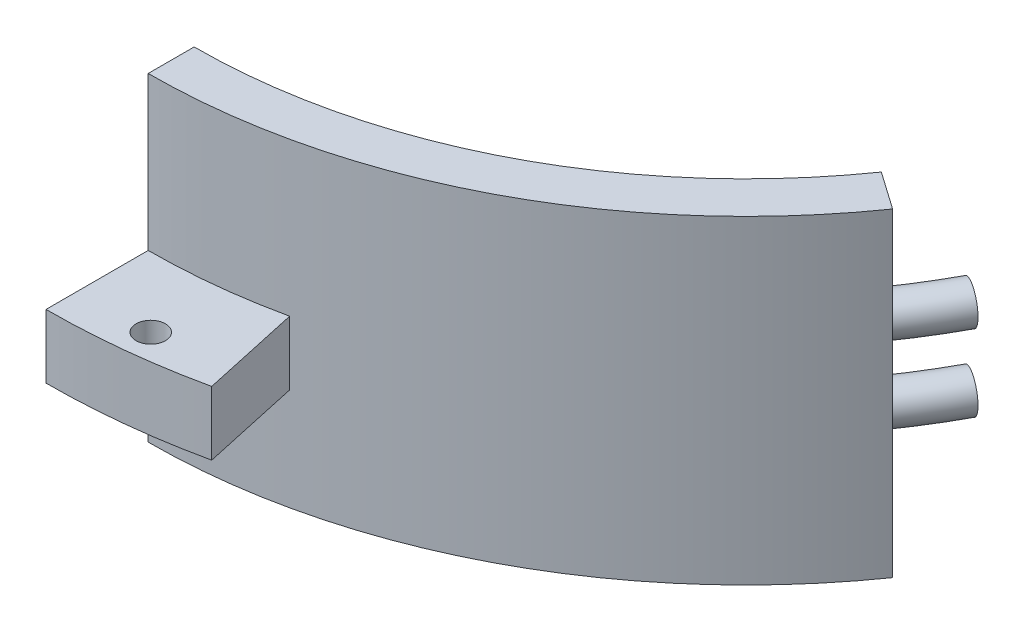
ISO-10303-21;
HEADER;
FILE_DESCRIPTION(('STEP AP214'),'2;1');
FILE_NAME('part.step','',(''),(''),'','','');
FILE_SCHEMA(('AUTOMOTIVE_DESIGN { 1 0 10303 214 1 1 1 1 }'));
ENDSEC;
DATA;
#1=APPLICATION_CONTEXT('core data for automotive mechanical design processes');
#2=APPLICATION_PROTOCOL_DEFINITION('international standard','automotive_design',2000,#1);
#3=PRODUCT_CONTEXT('',#1,'mechanical');
#4=PRODUCT('Part','Part','',(#3));
#5=PRODUCT_RELATED_PRODUCT_CATEGORY('part','',(#4));
#6=PRODUCT_DEFINITION_FORMATION('','',#4);
#7=PRODUCT_DEFINITION_CONTEXT('part definition',#1,'design');
#8=PRODUCT_DEFINITION('design','',#6,#7);
#9=PRODUCT_DEFINITION_SHAPE('','',#8);
#10=(LENGTH_UNIT() NAMED_UNIT(*) SI_UNIT(.MILLI.,.METRE.));
#11=(NAMED_UNIT(*) PLANE_ANGLE_UNIT() SI_UNIT($,.RADIAN.));
#12=(NAMED_UNIT(*) SI_UNIT($,.STERADIAN.) SOLID_ANGLE_UNIT());
#13=UNCERTAINTY_MEASURE_WITH_UNIT(LENGTH_MEASURE(1.E-05),#10,'distance_accuracy_value','');
#14=(GEOMETRIC_REPRESENTATION_CONTEXT(3) GLOBAL_UNCERTAINTY_ASSIGNED_CONTEXT((#13)) GLOBAL_UNIT_ASSIGNED_CONTEXT((#10,
#11,#12)) REPRESENTATION_CONTEXT('',''));
#15=CARTESIAN_POINT('',(0.,0.,0.));
#16=DIRECTION('',(0.,0.,1.));
#17=DIRECTION('',(1.,0.,0.));
#18=AXIS2_PLACEMENT_3D('',#15,#16,#17);
#19=CARTESIAN_POINT('',(0.,25.,0.));
#20=DIRECTION('',(-0.573576436351044,0.,0.819152044288993));
#21=DIRECTION('',(0.819152044288993,0.,0.573576436351044));
#22=AXIS2_PLACEMENT_3D('',#19,#20,#21);
#23=PLANE('',#22);
#24=CARTESIAN_POINT('',(35.5511987221423,15.5,24.8932173376353));
#25=DIRECTION('',(0.573576436351044,0.,-0.819152044288993));
#26=DIRECTION('',(-0.819152044288993,0.,-0.573576436351044));
#27=AXIS2_PLACEMENT_3D('',#24,#25,#26);
#28=CIRCLE('',#27,1.5);
#29=CARTESIAN_POINT('',(36.7799267885758,15.5,25.7535819921619));
#30=VERTEX_POINT('',#29);
#31=EDGE_CURVE('E254',#30,#30,#28,.T.);
#32=ORIENTED_EDGE('',*,*,#31,.F.);
#33=EDGE_LOOP('',(#32));
#34=FACE_BOUND('',#33,.T.);
#35=CARTESIAN_POINT('',(35.5511987221423,9.5,24.8932173376353));
#36=DIRECTION('',(0.573576436351044,0.,-0.819152044288993));
#37=DIRECTION('',(-0.819152044288993,0.,-0.573576436351044));
#38=AXIS2_PLACEMENT_3D('',#35,#36,#37);
#39=CIRCLE('',#38,1.5);
#40=CARTESIAN_POINT('',(36.7799267885758,9.5,25.7535819921619));
#41=VERTEX_POINT('',#40);
#42=EDGE_CURVE('E259',#41,#41,#39,.T.);
#43=ORIENTED_EDGE('',*,*,#42,.F.);
#44=EDGE_LOOP('',(#43));
#45=FACE_BOUND('',#44,.T.);
#46=CARTESIAN_POINT('',(32.7660817715598,8.,22.9430574540417));
#47=CARTESIAN_POINT('',(32.8270003835312,8.1838450454888,22.9857131253614));
#48=CARTESIAN_POINT('',(32.8841749354407,8.36949906268212,23.0257471776022));
#49=CARTESIAN_POINT('',(32.9909228311533,8.74404467422984,23.1004928588682));
#50=CARTESIAN_POINT('',(33.0404958465034,8.93293640809015,23.1352042579082));
#51=CARTESIAN_POINT('',(33.1777595826913,9.50438997927506,23.2313173607097));
#52=CARTESIAN_POINT('',(33.2538290071181,9.89122913980044,23.2845817451207));
#53=CARTESIAN_POINT('',(33.3650703795982,10.6131160650073,23.362473792692));
#54=CARTESIAN_POINT('',(33.4046824576944,10.9471673830154,23.3902104683791));
#55=CARTESIAN_POINT('',(33.4607385745391,11.6182972283327,23.4294613839565));
#56=CARTESIAN_POINT('',(33.4771747242254,11.9553767471641,23.440970099866));
#57=CARTESIAN_POINT('',(33.4867232864888,12.6301327657193,23.4476560751419));
#58=CARTESIAN_POINT('',(33.4798288545825,12.9678094115783,23.4428285419494));
#59=CARTESIAN_POINT('',(33.442775263501,13.641105093788,23.4168833381565));
#60=CARTESIAN_POINT('',(33.4126227800606,13.9767246927135,23.3957703419557));
#61=CARTESIAN_POINT('',(33.3132890128804,14.7712180380297,23.3262160893774));
#62=CARTESIAN_POINT('',(33.2336021652732,15.2282287534553,23.2704187579867));
#63=CARTESIAN_POINT('',(33.0819888975678,15.9022633539902,23.1642580050468));
#64=CARTESIAN_POINT('',(33.0261511747076,16.1248854682659,23.1251600105836));
#65=CARTESIAN_POINT('',(32.903958668809,16.565832236057,23.0395998968406));
#66=CARTESIAN_POINT('',(32.8376019295436,16.7841560817142,22.993136407796));
#67=CARTESIAN_POINT('',(32.7660817715597,17.,22.9430574540417));
#68=B_SPLINE_CURVE_WITH_KNOTS('',3,(#46,#47,#48,#49,#50,#51,#52,#53,#54,#55,#56,#57,#58,#59,#60,
#61,#62,#63,#64,#65,#66,#67),.UNSPECIFIED.,.F.,.F.,(4,2,2,2,2,2,2,2,2,2,4),(0.,
0.594815778347208,1.18965725071462,2.38095450329773,3.39242766294243,4.40424504396403,
5.41635928717656,6.42818313232573,7.82630443008352,8.52444827888181,9.22272211450163),.UNSPECIFIED.);
#69=CARTESIAN_POINT('',(32.7660817715593,8.,22.9430574540424));
#70=VERTEX_POINT('',#69);
#71=CARTESIAN_POINT('',(32.7660817715597,17.,22.9430574540417));
#72=VERTEX_POINT('',#71);
#73=EDGE_CURVE('E63',#70,#72,#68,.T.);
#74=ORIENTED_EDGE('',*,*,#73,.T.);
#75=DIRECTION('',(0.,1.,0.));
#76=VECTOR('',#75,1.);
#77=CARTESIAN_POINT('',(32.7660817715597,6.,22.9430574540417));
#78=LINE('',#77,#76);
#79=CARTESIAN_POINT('',(32.7660817715597,19.,22.9430574540417));
#80=VERTEX_POINT('',#79);
#81=EDGE_CURVE('E173',#72,#80,#78,.T.);
#82=ORIENTED_EDGE('',*,*,#81,.T.);
#83=DIRECTION('',(-0.819152044288993,0.,-0.573576436351044));
#84=VECTOR('',#83,1.);
#85=CARTESIAN_POINT('',(0.,19.,0.));
#86=LINE('',#85,#84);
#87=CARTESIAN_POINT('',(35.3873683132845,19.,24.7785020503651));
#88=VERTEX_POINT('',#87);
#89=EDGE_CURVE('E195',#88,#80,#86,.T.);
#90=ORIENTED_EDGE('',*,*,#89,.F.);
#91=DIRECTION('',(0.,-1.,0.));
#92=VECTOR('',#91,1.);
#93=CARTESIAN_POINT('',(35.3873683132845,25.,24.7785020503651));
#94=LINE('',#93,#92);
#95=CARTESIAN_POINT('',(35.3873683132845,25.,24.7785020503651));
#96=VERTEX_POINT('',#95);
#97=EDGE_CURVE('E444',#96,#88,#94,.T.);
#98=ORIENTED_EDGE('',*,*,#97,.F.);
#99=DIRECTION('',(-0.819152044288993,0.,-0.573576436351044));
#100=VECTOR('',#99,1.);
#101=CARTESIAN_POINT('',(0.,25.,0.));
#102=LINE('',#101,#100);
#103=CARTESIAN_POINT('',(38.3363156727249,25.,26.8433772212288));
#104=VERTEX_POINT('',#103);
#105=EDGE_CURVE('E458',#104,#96,#102,.T.);
#106=ORIENTED_EDGE('',*,*,#105,.F.);
#107=DIRECTION('',(0.,-1.,0.));
#108=VECTOR('',#107,1.);
#109=CARTESIAN_POINT('',(38.3363156727249,25.,26.8433772212288));
#110=LINE('',#109,#108);
#111=CARTESIAN_POINT('',(38.3363156727249,0.,26.8433772212288));
#112=VERTEX_POINT('',#111);
#113=EDGE_CURVE('E179',#104,#112,#110,.T.);
#114=ORIENTED_EDGE('',*,*,#113,.T.);
#115=DIRECTION('',(-0.819152044288993,0.,-0.573576436351044));
#116=VECTOR('',#115,1.);
#117=CARTESIAN_POINT('',(0.,0.,0.));
#118=LINE('',#117,#116);
#119=CARTESIAN_POINT('',(35.3873683132845,0.,24.7785020503651));
#120=VERTEX_POINT('',#119);
#121=EDGE_CURVE('E182',#112,#120,#118,.T.);
#122=ORIENTED_EDGE('',*,*,#121,.T.);
#123=CARTESIAN_POINT('',(35.3873683132845,6.,24.7785020503651));
#124=VERTEX_POINT('',#123);
#125=EDGE_CURVE('E203',#124,#120,#94,.T.);
#126=ORIENTED_EDGE('',*,*,#125,.F.);
#127=DIRECTION('',(-0.819152044288993,0.,-0.573576436351044));
#128=VECTOR('',#127,1.);
#129=CARTESIAN_POINT('',(0.,6.,0.));
#130=LINE('',#129,#128);
#131=CARTESIAN_POINT('',(32.7660817715597,6.,22.9430574540417));
#132=VERTEX_POINT('',#131);
#133=EDGE_CURVE('E205',#124,#132,#130,.T.);
#134=ORIENTED_EDGE('',*,*,#133,.T.);
#135=EDGE_CURVE('E188',#132,#70,#78,.T.);
#136=ORIENTED_EDGE('',*,*,#135,.T.);
#137=EDGE_LOOP('',(#74,#82,#90,#98,#106,#114,#122,#126,#134,#136));
#138=FACE_BOUND('',#137,.T.);
#139=ADVANCED_FACE('F44',(#34,#45,#138),#23,.F.);
#140=CARTESIAN_POINT('',(22.7289436710427,-0.001000000000001,29.0278038637026));
#141=DIRECTION('',(0.616502226486559,0.,0.787353163921448));
#142=DIRECTION('',(0.787353163921448,0.,-0.616502226486559));
#143=AXIS2_PLACEMENT_3D('',#140,#141,#142);
#144=PLANE('',#143);
#145=CARTESIAN_POINT('',(10.511446450504,16.999999999965,38.5941771077919));
#146=CARTESIAN_POINT('',(10.3983241177963,16.8622081129774,38.6827525674685));
#147=CARTESIAN_POINT('',(10.2886770451364,16.719662472892,38.768606878952));
#148=CARTESIAN_POINT('',(10.077506819324,16.4247046319397,38.9339544254877));
#149=CARTESIAN_POINT('',(9.97599932429459,16.2722743883556,39.013435400138));
#150=CARTESIAN_POINT('',(9.78190875577101,15.9563897597597,39.165409473838));
#151=CARTESIAN_POINT('',(9.68940745211358,15.7928538124784,39.2378385466151));
#152=CARTESIAN_POINT('',(9.51598558894933,15.4562672430757,39.3736289004582));
#153=CARTESIAN_POINT('',(9.43505642160125,15.2832238270415,39.4369969215152));
#154=CARTESIAN_POINT('',(9.3023480830551,14.9662191258481,39.5409083426451));
#155=CARTESIAN_POINT('',(9.24803767243434,14.8239640988108,39.5834337182974));
#156=CARTESIAN_POINT('',(9.14842699003871,14.5344641908483,39.6614294771145));
#157=CARTESIAN_POINT('',(9.10312465979991,14.3872204589291,39.6969014720688));
#158=CARTESIAN_POINT('',(9.02244165656115,14.0889274272966,39.7600767451432));
#159=CARTESIAN_POINT('',(8.98702941340481,13.9378919536904,39.7878047428842));
#160=CARTESIAN_POINT('',(8.92661648451725,13.6324867021624,39.8351084267637));
#161=CARTESIAN_POINT('',(8.90161558787886,13.4781169918503,39.8546842780437));
#162=CARTESIAN_POINT('',(8.86242528347652,13.1661651006418,39.8853705202891));
#163=CARTESIAN_POINT('',(8.84830537098195,13.0085687638149,39.8964264960438));
#164=CARTESIAN_POINT('',(8.83145671159779,12.6923903845923,39.9096190968989));
#165=CARTESIAN_POINT('',(8.82872809357768,12.5338083310655,39.9117556210938));
#166=CARTESIAN_POINT('',(8.83472515380918,12.2169702675079,39.9070598871404));
#167=CARTESIAN_POINT('',(8.84345272148694,12.0587143155716,39.9002261495603));
#168=CARTESIAN_POINT('',(8.87216726271664,11.7438699347598,39.8777424924013));
#169=CARTESIAN_POINT('',(8.89215379086772,11.58728144017,39.862092921574));
#170=CARTESIAN_POINT('',(8.94103310460406,11.2886617694008,39.8238201271935));
#171=CARTESIAN_POINT('',(8.96914249191342,11.146421867898,39.8018103091659));
#172=CARTESIAN_POINT('',(9.03413010484524,10.8651727317025,39.7509246203767));
#173=CARTESIAN_POINT('',(9.07101104994822,10.7261645136427,39.7220466202456));
#174=CARTESIAN_POINT('',(9.15303117302656,10.4518189069518,39.657824374357));
#175=CARTESIAN_POINT('',(9.19818731510076,10.3164897270284,39.6224668456089));
#176=CARTESIAN_POINT('',(9.29605828855413,10.0503054679575,39.5458332892746));
#177=CARTESIAN_POINT('',(9.34877457392507,9.91945125545957,39.5045561232041));
#178=CARTESIAN_POINT('',(9.47798900790852,9.62396210117037,39.4033804502085));
#179=CARTESIAN_POINT('',(9.55687109122436,9.46100481928364,39.3416153081826));
#180=CARTESIAN_POINT('',(9.7248090856848,9.14383059335641,39.2101188562208));
#181=CARTESIAN_POINT('',(9.81386531615413,8.98961392387526,39.1403872962517));
#182=CARTESIAN_POINT('',(10.0001927914512,8.69102754963693,38.9944917710415));
#183=CARTESIAN_POINT('',(10.0974090722795,8.54660220544848,38.91837084294));
#184=CARTESIAN_POINT('',(10.2991886386714,8.26669301629618,38.7603762381802));
#185=CARTESIAN_POINT('',(10.4037398086593,8.13119511126494,38.6785120480901));
#186=CARTESIAN_POINT('',(10.5114464432437,7.99999999590126,38.5941771103882));
#187=B_SPLINE_CURVE_WITH_KNOTS('',3,(#145,#146,#147,#148,#149,#150,#151,#152,#153,#154,#155,
#156,#157,#158,#159,#160,#161,#162,#163,#164,#165,#166,#167,#168,#169,#170,#171,#172,#173,#174,
#175,#176,#177,#178,#179,#180,#181,#182,#183,#184,#185,#186),.UNSPECIFIED.,.F.,.F.,(4,2,2,2,2,2,
2,2,2,2,2,2,2,2,2,2,2,2,2,2,4),(0.,0.597262385942001,1.1956474584976,1.7990388245451,
2.40197900153051,2.87582114062042,3.34955487584682,3.82175865586349,4.29395286977768,
4.76913848265389,5.24432947128016,5.71959884123879,6.19484941101473,6.63433628088957,
7.07395958463282,7.51449440493467,7.95511406425496,8.52826359057016,9.10143111064216,
9.67100764667232,10.2396645692963),.UNSPECIFIED.);
#188=CARTESIAN_POINT('',(10.5114648559293,17.0000112138551,38.5941626940219));
#189=VERTEX_POINT('',#188);
#190=CARTESIAN_POINT('',(10.5114648559761,7.99998878614824,38.5941626947298));
#191=VERTEX_POINT('',#190);
#192=EDGE_CURVE('E166',#189,#191,#187,.T.);
#193=ORIENTED_EDGE('',*,*,#192,.T.);
#194=DIRECTION('',(0.,1.,0.));
#195=VECTOR('',#194,1.);
#196=CARTESIAN_POINT('',(10.5114721474501,6.,38.5941569838412));
#197=LINE('',#196,#195);
#198=CARTESIAN_POINT('',(10.5114721474501,6.,38.5941569838412));
#199=VERTEX_POINT('',#198);
#200=EDGE_CURVE('E436',#199,#191,#197,.T.);
#201=ORIENTED_EDGE('',*,*,#200,.F.);
#202=DIRECTION('',(-0.787353163921448,0.,0.616502226486559));
#203=VECTOR('',#202,1.);
#204=CARTESIAN_POINT('',(22.7289436710427,6.,29.0278038637026));
#205=LINE('',#204,#203);
#206=CARTESIAN_POINT('',(5.,6.,42.9096725692471));
#207=VERTEX_POINT('',#206);
#208=EDGE_CURVE('E251',#199,#207,#205,.T.);
#209=ORIENTED_EDGE('',*,*,#208,.T.);
#210=DIRECTION('',(0.,1.,0.));
#211=VECTOR('',#210,1.);
#212=CARTESIAN_POINT('',(5.,-0.001000000000001,42.9096725692471));
#213=LINE('',#212,#211);
#214=CARTESIAN_POINT('',(5.,19.,42.9096725692471));
#215=VERTEX_POINT('',#214);
#216=EDGE_CURVE('E87',#207,#215,#213,.T.);
#217=ORIENTED_EDGE('',*,*,#216,.T.);
#218=DIRECTION('',(0.787353163921448,0.,-0.616502226486559));
#219=VECTOR('',#218,1.);
#220=CARTESIAN_POINT('',(22.7289436710427,19.,29.0278038637026));
#221=LINE('',#220,#219);
#222=CARTESIAN_POINT('',(10.5114721474501,19.,38.5941569838412));
#223=VERTEX_POINT('',#222);
#224=EDGE_CURVE('E250',#215,#223,#221,.T.);
#225=ORIENTED_EDGE('',*,*,#224,.T.);
#226=DIRECTION('',(0.,1.,0.));
#227=VECTOR('',#226,1.);
#228=CARTESIAN_POINT('',(10.5114721474501,6.,38.5941569838412));
#229=LINE('',#228,#227);
#230=EDGE_CURVE('E77',#189,#223,#229,.T.);
#231=ORIENTED_EDGE('',*,*,#230,.F.);
#232=EDGE_LOOP('',(#193,#201,#209,#217,#225,#231));
#233=FACE_BOUND('',#232,.T.);
#234=ADVANCED_FACE('F363',(#233),#144,.F.);
#235=CARTESIAN_POINT('',(0.,6.,0.));
#236=DIRECTION('',(0.,1.,0.));
#237=DIRECTION('',(0.,0.,1.));
#238=AXIS2_PLACEMENT_3D('',#235,#236,#237);
#239=CYLINDRICAL_SURFACE('',#238,40.);
#240=CARTESIAN_POINT('',(33.3304602689116,8.,22.117064794543));
#241=CARTESIAN_POINT('',(33.1448209547308,7.99999999999815,22.3949349206173));
#242=CARTESIAN_POINT('',(32.9526107079189,8.,22.6766665432681));
#243=CARTESIAN_POINT('',(31.1572635264626,8.,25.2406878697077));
#244=CARTESIAN_POINT('',(29.265670203403,7.99999999999997,27.4050980327879));
#245=CARTESIAN_POINT('',(25.044069641658,7.99999999999997,31.310084252698));
#246=CARTESIAN_POINT('',(22.7296757305404,7.9999999998813,33.0411562316216));
#247=CARTESIAN_POINT('',(17.742690298946,8.00000000011886,35.9659998319003));
#248=CARTESIAN_POINT('',(15.1240639877221,8.00000000008528,37.1404841465879));
#249=CARTESIAN_POINT('',(9.69518772230309,7.99999999991482,38.9121604133115));
#250=CARTESIAN_POINT('',(6.94869622000333,8.,39.4875520770828));
#251=CARTESIAN_POINT('',(4.19276780794604,8.,39.7797430456407));
#252=(BOUNDED_CURVE() B_SPLINE_CURVE(3,(#240,#241,#242,#243,#244,#245,#246,#247,#248,#249,#250,
#251),.UNSPECIFIED.,.F.,.F.) B_SPLINE_CURVE_WITH_KNOTS((4,2,2,2,2,4),(0.,0.0281689091133075,
0.271126681834981,0.514084454556654,0.757042227278327,1.),
.UNSPECIFIED.) CURVE() GEOMETRIC_REPRESENTATION_ITEM() RATIONAL_B_SPLINE_CURVE((1.,1.,1.,1.,1.,
1.,1.,1.,1.,1.,1.,1.)) REPRESENTATION_ITEM(''));
#253=CARTESIAN_POINT('',(20.2361830522751,8.00000000000008,34.5035780097487));
#254=VERTEX_POINT('',#253);
#255=EDGE_CURVE('E157',#254,#191,#252,.T.);
#256=ORIENTED_EDGE('',*,*,#255,.F.);
#257=CARTESIAN_POINT('',(32.7660817715597,8.,22.9430574540417));
#258=CARTESIAN_POINT('',(32.5512871048039,8.00001402454349,23.2498186212154));
#259=CARTESIAN_POINT('',(32.3321827101562,8.00057412001977,23.5535608980064));
#260=CARTESIAN_POINT('',(31.8855330495796,8.00239611502807,24.1547715251871));
#261=CARTESIAN_POINT('',(31.6579878035212,8.00365801290807,24.4522398903435));
#262=CARTESIAN_POINT('',(31.1946375138599,8.00649325722564,25.0406635475503));
#263=CARTESIAN_POINT('',(30.9588325951679,8.00806659895491,25.3316189379873));
#264=CARTESIAN_POINT('',(30.479145247165,8.01122906814854,25.9067932021739));
#265=CARTESIAN_POINT('',(30.2352628166501,8.01281819561525,26.1910120749193));
#266=CARTESIAN_POINT('',(29.7396127496508,8.01578057556104,26.7524889502938));
#267=CARTESIAN_POINT('',(29.4878451336604,8.01715382860113,27.029746971011));
#268=CARTESIAN_POINT('',(28.9766223344426,8.01952667048983,27.5770845033671));
#269=CARTESIAN_POINT('',(28.7171671492112,8.02052625924102,27.8471640131345));
#270=CARTESIAN_POINT('',(28.1904379150495,8.02204722264376,28.3802713372244));
#271=CARTESIAN_POINT('',(27.9231543053288,8.02256798503941,28.643289706968));
#272=CARTESIAN_POINT('',(27.3812969841308,8.02314232413043,29.1617072013598));
#273=CARTESIAN_POINT('',(27.1067232747702,8.02319590096143,29.41710632822));
#274=CARTESIAN_POINT('',(26.5505120592977,8.02257726257322,29.9200750701628));
#275=CARTESIAN_POINT('',(26.2688747696598,8.02190506956982,30.1676449246605));
#276=CARTESIAN_POINT('',(25.6987515706582,8.02006964439366,30.6547671662216));
#277=CARTESIAN_POINT('',(25.4102656592121,8.0189064120716,30.894319550847));
#278=CARTESIAN_POINT('',(24.8266859287911,8.01629231671945,31.3652073919824));
#279=CARTESIAN_POINT('',(24.531592398298,8.01484146622483,31.5965432060833));
#280=CARTESIAN_POINT('',(23.9350181513236,8.01186352540523,32.0508264318783));
#281=CARTESIAN_POINT('',(23.6335374337781,8.01033643506755,32.273773842175));
#282=CARTESIAN_POINT('',(23.0241804889,8.00740783412203,32.7112810422962));
#283=CARTESIAN_POINT('',(22.7162993004445,8.00600642577106,32.9258339236156));
#284=CARTESIAN_POINT('',(22.0946221507558,8.00353721564079,33.3461912355294));
#285=CARTESIAN_POINT('',(21.7808261926983,8.00246941368237,33.551995670821));
#286=CARTESIAN_POINT('',(21.1475443190418,8.00083349559264,33.9547077385933));
#287=CARTESIAN_POINT('',(20.8280580911655,8.0002654069719,34.1516148806877));
#288=CARTESIAN_POINT('',(20.344778280668,7.99999510925095,34.4401684493417));
#289=CARTESIAN_POINT('',(20.1830086504783,8.00000198487635,34.5352191654033));
#290=CARTESIAN_POINT('',(19.8581452370731,7.99997847531138,34.7230366266211));
#291=CARTESIAN_POINT('',(19.695051428647,7.99994808940994,34.8158033281565));
#292=CARTESIAN_POINT('',(19.2037970604798,7.99983461426662,35.090668397388));
#293=CARTESIAN_POINT('',(18.8736933940177,7.9997292090806,35.2693139153461));
#294=CARTESIAN_POINT('',(18.2085918311078,7.99952488501093,35.6172442073823));
#295=CARTESIAN_POINT('',(17.8735936836747,7.99942596646136,35.7865284992785));
#296=CARTESIAN_POINT('',(16.8632338380194,7.99922174001494,36.2793587624151));
#297=CARTESIAN_POINT('',(16.1808862060956,7.99920801779583,36.5887886450209));
#298=CARTESIAN_POINT('',(15.145335994516,7.99938045894962,37.0237633630046));
#299=CARTESIAN_POINT('',(14.7981607025198,7.9994701032795,37.1638886639219));
#300=CARTESIAN_POINT('',(14.0999931728938,7.99967144039608,37.4343465872679));
#301=CARTESIAN_POINT('',(13.7490008780113,7.99978313351393,37.5646790625778));
#302=CARTESIAN_POINT('',(13.043704731844,7.99994364362072,37.8153642256428));
#303=CARTESIAN_POINT('',(12.6894029142028,7.99999249695361,37.9357226442621));
#304=CARTESIAN_POINT('',(11.9775768747516,8.00000666757676,38.16644623477));
#305=CARTESIAN_POINT('',(11.6200528359509,7.99997198958185,38.2768119703185));
#306=CARTESIAN_POINT('',(11.030615304897,7.99995176536164,38.4497491077471));
#307=CARTESIAN_POINT('',(10.7995662851105,7.99995307232086,38.5152832512963));
#308=CARTESIAN_POINT('',(10.3363621141351,7.99997796790417,38.6421696013228));
#309=CARTESIAN_POINT('',(10.1042071523411,8.00000155284058,38.7035224981217));
#310=CARTESIAN_POINT('',(9.63907122146344,8.00007688903231,38.8219762691708));
#311=CARTESIAN_POINT('',(9.40609135558761,8.00012861111886,38.8790814772792));
#312=CARTESIAN_POINT('',(8.9391038164597,8.00025450729241,38.9891008188463));
#313=CARTESIAN_POINT('',(8.70509598088509,8.00032868506081,39.0420142633075));
#314=CARTESIAN_POINT('',(8.47063077192384,8.00041123329432,39.0928179378992));
#315=B_SPLINE_CURVE_WITH_KNOTS('',3,(#257,#258,#259,#260,#261,#262,#263,#264,#265,#266,#267,
#268,#269,#270,#271,#272,#273,#274,#275,#276,#277,#278,#279,#280,#281,#282,#283,#284,#285,#286,
#287,#288,#289,#290,#291,#292,#293,#294,#295,#296,#297,#298,#299,#300,#301,#302,#303,#304,#305,
#306,#307,#308,#309,#310,#311,#312,#313,#314),.UNSPECIFIED.,.F.,.F.,(4,2,2,2,2,2,2,2,2,2,2,2,2,
2,2,2,2,2,2,2,2,2,2,2,2,2,2,2,4),(0.,1.12341693403837,2.24683122362993,3.37022853117432,
4.49362600617598,5.61702056166245,6.7404154100023,7.86524470836771,8.99007368015576,
10.1148682219152,11.2396631056997,12.3644089774824,13.489155036647,14.6148080588405,
15.740460476654,16.8661748608354,17.429040863324,17.9919176072867,19.1177753085178,
20.2436909469592,22.4899590973485,23.6130111010308,24.736079973085,25.858499015599,
26.9808547060377,27.7013094853766,28.4216450284145,29.1412352446169,29.8609434950511),.UNSPECIFIED.);
#316=EDGE_CURVE('E154',#70,#254,#315,.T.);
#317=ORIENTED_EDGE('',*,*,#316,.F.);
#318=ORIENTED_EDGE('',*,*,#135,.F.);
#319=CARTESIAN_POINT('',(0.,6.,0.));
#320=DIRECTION('',(0.,1.,0.));
#321=DIRECTION('',(0.,0.,1.));
#322=AXIS2_PLACEMENT_3D('',#319,#320,#321);
#323=CIRCLE('',#322,40.);
#324=EDGE_CURVE('E199',#199,#132,#323,.T.);
#325=ORIENTED_EDGE('',*,*,#324,.F.);
#326=ORIENTED_EDGE('',*,*,#200,.T.);
#327=EDGE_LOOP('',(#256,#317,#318,#325,#326));
#328=FACE_BOUND('',#327,.T.);
#329=ADVANCED_FACE('F46',(#328),#239,.F.);
#330=CARTESIAN_POINT('',(32.7660817715597,17.,22.9430574540417));
#331=CARTESIAN_POINT('',(32.5512871048034,16.9999859754556,23.249818621216));
#332=CARTESIAN_POINT('',(32.3321827101552,16.9994258799785,23.5535608980077));
#333=CARTESIAN_POINT('',(31.8855330495776,16.997603884969,24.1547715251897));
#334=CARTESIAN_POINT('',(31.6579878035187,16.9963419870886,24.4522398903467));
#335=CARTESIAN_POINT('',(31.1946375138563,16.9935067427706,25.0406635475548));
#336=CARTESIAN_POINT('',(30.9588325951637,16.9919334010414,25.3316189379925));
#337=CARTESIAN_POINT('',(30.4791452471595,16.9887709318479,25.9067932021803));
#338=CARTESIAN_POINT('',(30.235262816644,16.9871818043814,26.1910120749263));
#339=CARTESIAN_POINT('',(29.7396127496434,16.9842194244361,26.752488950302));
#340=CARTESIAN_POINT('',(29.4878451336523,16.9828461713964,27.0297469710199));
#341=CARTESIAN_POINT('',(28.9766223344331,16.9804733295085,27.5770845033771));
#342=CARTESIAN_POINT('',(28.717167149201,16.9794737407577,27.8471640131451));
#343=CARTESIAN_POINT('',(28.1904379150378,16.9779527773554,28.380271337236));
#344=CARTESIAN_POINT('',(27.9231543053164,16.9774320149599,28.6432897069801));
#345=CARTESIAN_POINT('',(27.381296984117,16.9768576758697,29.1617072013728));
#346=CARTESIAN_POINT('',(27.1067232747556,16.9768040990395,29.4171063282335));
#347=CARTESIAN_POINT('',(26.5505120592816,16.977422737422,29.9200750701771));
#348=CARTESIAN_POINT('',(26.2688747696429,16.9780949304189,30.1676449246753));
#349=CARTESIAN_POINT('',(25.6987515706397,16.9799303555787,30.6547671662372));
#350=CARTESIAN_POINT('',(25.4102656591927,16.9810935878907,30.894319550863));
#351=CARTESIAN_POINT('',(24.82668592877,16.9837076832224,31.365207391999));
#352=CARTESIAN_POINT('',(24.5315923982761,16.9851585337065,31.5965432061003));
#353=CARTESIAN_POINT('',(23.9350181512999,16.9881364745077,32.050826431896));
#354=CARTESIAN_POINT('',(23.6335374337535,16.9896635648376,32.273773842193));
#355=CARTESIAN_POINT('',(23.0241804888742,16.9925921657732,32.7112810423143));
#356=CARTESIAN_POINT('',(22.7162993004185,16.9939935741221,32.9258339236335));
#357=CARTESIAN_POINT('',(22.0946221507293,16.9964627842573,33.346191235547));
#358=CARTESIAN_POINT('',(21.7808261926715,16.9975305862227,33.5519956708384));
#359=CARTESIAN_POINT('',(21.1475443190145,16.999166504338,33.9547077386103));
#360=CARTESIAN_POINT('',(20.8280580911379,16.9997345929772,34.1516148807045));
#361=CARTESIAN_POINT('',(20.3447782806401,17.0000048907388,34.4401684493582));
#362=CARTESIAN_POINT('',(20.1830086504503,16.9999980151291,34.5352191654197));
#363=CARTESIAN_POINT('',(19.8581452370447,17.0000215247228,34.7230366266373));
#364=CARTESIAN_POINT('',(19.6950514286185,17.0000519106373,34.8158033281726));
#365=CARTESIAN_POINT('',(19.2037970604509,17.0001653858161,35.0906683974038));
#366=CARTESIAN_POINT('',(18.8736933939886,17.0002707910211,35.2693139153617));
#367=CARTESIAN_POINT('',(18.2085918310782,17.0004751151198,35.6172442073974));
#368=CARTESIAN_POINT('',(17.8735936836449,17.0005740336795,35.7865284992935));
#369=CARTESIAN_POINT('',(16.8632338379887,17.0007782601442,36.2793587624293));
#370=CARTESIAN_POINT('',(16.1808862060645,17.0007919823597,36.5887886450346));
#371=CARTESIAN_POINT('',(15.1453359944841,17.0006195411816,37.0237633630176));
#372=CARTESIAN_POINT('',(14.7981607024877,17.0005298968404,37.1638886639347));
#373=CARTESIAN_POINT('',(14.0999931728612,17.0003285596966,37.4343465872802));
#374=CARTESIAN_POINT('',(13.7490008779784,17.0002168665628,37.5646790625898));
#375=CARTESIAN_POINT('',(13.0437047318107,17.0000563564173,37.8153642256543));
#376=CARTESIAN_POINT('',(12.6894029141692,17.0000075030617,37.9357226442733));
#377=CARTESIAN_POINT('',(11.9775768747176,16.9999933323987,38.1664462347807));
#378=CARTESIAN_POINT('',(11.6200528359166,17.0000280103765,38.2768119703289));
#379=CARTESIAN_POINT('',(11.0306153048653,17.0000482345779,38.4497491077562));
#380=CARTESIAN_POINT('',(10.7995662850817,17.0000469276136,38.5152832513043));
#381=CARTESIAN_POINT('',(10.336362114112,17.0000220320231,38.6421696013289));
#382=CARTESIAN_POINT('',(10.104207152321,16.9999984470846,38.7035224981269));
#383=CARTESIAN_POINT('',(9.63907122144905,16.9999231108915,38.8219762691743));
#384=CARTESIAN_POINT('',(9.40609135557613,16.9998713888056,38.8790814772819));
#385=CARTESIAN_POINT('',(8.93910381645406,16.9997454926354,38.9891008188476));
#386=CARTESIAN_POINT('',(8.70509598088239,16.9996713148697,39.0420142633081));
#387=CARTESIAN_POINT('',(8.47063077192408,16.9995887666394,39.0928179378992));
#388=B_SPLINE_CURVE_WITH_KNOTS('',3,(#330,#331,#332,#333,#334,#335,#336,#337,#338,#339,#340,
#341,#342,#343,#344,#345,#346,#347,#348,#349,#350,#351,#352,#353,#354,#355,#356,#357,#358,#359,
#360,#361,#362,#363,#364,#365,#366,#367,#368,#369,#370,#371,#372,#373,#374,#375,#376,#377,#378,
#379,#380,#381,#382,#383,#384,#385,#386,#387),.UNSPECIFIED.,.F.,.F.,(4,2,2,2,2,2,2,2,2,2,2,2,2,
2,2,2,2,2,2,2,2,2,2,2,2,2,2,2,4),(0.,1.12341693404082,2.24683122363483,3.37022853118185,
4.49362600618614,5.61702056167534,6.74041541001792,7.86524470838587,8.99007368017648,
10.1148682219385,11.2396631057255,12.3644089775108,13.489155036678,14.6148080588719,
15.7404604766858,16.8661748608676,17.4290408633564,17.9919176073193,19.1177753085508,
20.2436909469925,22.4899590973827,23.6130111010654,24.7360799731199,25.8584990156344,
26.9808547060735,27.7013094854033,28.4216450284322,29.1412352446256,29.8609434950507),.UNSPECIFIED.);
#389=CARTESIAN_POINT('',(20.2361830522752,17.0000000000001,34.5035780097486));
#390=VERTEX_POINT('',#389);
#391=EDGE_CURVE('E11',#390,#72,#388,.F.);
#392=ORIENTED_EDGE('',*,*,#391,.F.);
#393=CARTESIAN_POINT('',(4.19276780794609,17.,39.7797430456407));
#394=CARTESIAN_POINT('',(6.94869622000343,17.,39.4875520770828));
#395=CARTESIAN_POINT('',(9.69518772230317,16.9999999999148,38.9121604133115));
#396=CARTESIAN_POINT('',(15.1240639877222,17.0000000000853,37.1404841465879));
#397=CARTESIAN_POINT('',(17.7426902989461,17.0000000001189,35.9659998319002));
#398=CARTESIAN_POINT('',(22.7296757305405,16.9999999998813,33.0411562316216));
#399=CARTESIAN_POINT('',(25.044069641658,17.,31.310084252698));
#400=CARTESIAN_POINT('',(29.2656702034031,17.,27.4050980327878));
#401=CARTESIAN_POINT('',(31.1572635264626,17.,25.2406878697024));
#402=CARTESIAN_POINT('',(32.9526107079189,17.,22.6766665432687));
#403=CARTESIAN_POINT('',(33.144820954731,17.,22.3949349206168));
#404=CARTESIAN_POINT('',(33.3304602689117,17.,22.1170647945429));
#405=(BOUNDED_CURVE() B_SPLINE_CURVE(3,(#393,#394,#395,#396,#397,#398,#399,#400,#401,#402,#403,
#404),.UNSPECIFIED.,.F.,.F.) B_SPLINE_CURVE_WITH_KNOTS((4,2,2,2,2,4),(0.,0.242957772721673,
0.485915545443346,0.728873318165019,0.971831090886693,1.),
.UNSPECIFIED.) CURVE() GEOMETRIC_REPRESENTATION_ITEM() RATIONAL_B_SPLINE_CURVE((1.,1.,1.,1.,1.,
1.,1.,1.,1.,1.,1.,1.)) REPRESENTATION_ITEM(''));
#406=EDGE_CURVE('E55',#189,#390,#405,.T.);
#407=ORIENTED_EDGE('',*,*,#406,.F.);
#408=ORIENTED_EDGE('',*,*,#230,.T.);
#409=CARTESIAN_POINT('',(0.,19.,0.));
#410=DIRECTION('',(0.,1.,0.));
#411=DIRECTION('',(0.,0.,1.));
#412=AXIS2_PLACEMENT_3D('',#409,#410,#411);
#413=CIRCLE('',#412,40.);
#414=EDGE_CURVE('E175',#223,#80,#413,.T.);
#415=ORIENTED_EDGE('',*,*,#414,.T.);
#416=ORIENTED_EDGE('',*,*,#81,.F.);
#417=EDGE_LOOP('',(#392,#407,#408,#415,#416));
#418=FACE_BOUND('',#417,.T.);
#419=ADVANCED_FACE('F172',(#418),#239,.F.);
#420=CARTESIAN_POINT('',(0.,25.,0.));
#421=DIRECTION('',(0.,-1.,0.));
#422=DIRECTION('',(0.,0.,-1.));
#423=AXIS2_PLACEMENT_3D('',#420,#421,#422);
#424=CYLINDRICAL_SURFACE('',#423,46.8);
#425=CARTESIAN_POINT('',(0.,8.,0.));
#426=DIRECTION('',(0.,1.,0.));
#427=DIRECTION('',(0.,0.,1.));
#428=AXIS2_PLACEMENT_3D('',#425,#426,#427);
#429=CIRCLE('',#428,46.8);
#430=CARTESIAN_POINT('',(0.,8.,46.8));
#431=VERTEX_POINT('',#430);
#432=CARTESIAN_POINT('',(10.,8.,45.7191425991345));
#433=VERTEX_POINT('',#432);
#434=EDGE_CURVE('E218',#431,#433,#429,.T.);
#435=ORIENTED_EDGE('',*,*,#434,.F.);
#436=DIRECTION('',(0.,-1.,0.));
#437=VECTOR('',#436,1.);
#438=CARTESIAN_POINT('',(0.,25.,46.8));
#439=LINE('',#438,#437);
#440=CARTESIAN_POINT('',(0.,0.,46.8));
#441=VERTEX_POINT('',#440);
#442=EDGE_CURVE('E447',#431,#441,#439,.T.);
#443=ORIENTED_EDGE('',*,*,#442,.T.);
#444=CARTESIAN_POINT('',(0.,0.,0.));
#445=DIRECTION('',(0.,1.,0.));
#446=DIRECTION('',(0.,0.,1.));
#447=AXIS2_PLACEMENT_3D('',#444,#445,#446);
#448=CIRCLE('',#447,46.8);
#449=EDGE_CURVE('E446',#441,#112,#448,.T.);
#450=ORIENTED_EDGE('',*,*,#449,.T.);
#451=ORIENTED_EDGE('',*,*,#113,.F.);
#452=CARTESIAN_POINT('',(0.,25.,0.));
#453=DIRECTION('',(0.,1.,0.));
#454=DIRECTION('',(0.,0.,1.));
#455=AXIS2_PLACEMENT_3D('',#452,#453,#454);
#456=CIRCLE('',#455,46.8);
#457=CARTESIAN_POINT('',(0.,25.,46.8));
#458=VERTEX_POINT('',#457);
#459=EDGE_CURVE('E460',#458,#104,#456,.T.);
#460=ORIENTED_EDGE('',*,*,#459,.F.);
#461=CARTESIAN_POINT('',(0.,13.,46.8));
#462=VERTEX_POINT('',#461);
#463=EDGE_CURVE('E225',#458,#462,#439,.T.);
#464=ORIENTED_EDGE('',*,*,#463,.T.);
#465=CARTESIAN_POINT('',(0.,13.,0.));
#466=DIRECTION('',(0.,1.,0.));
#467=DIRECTION('',(0.,0.,1.));
#468=AXIS2_PLACEMENT_3D('',#465,#466,#467);
#469=CIRCLE('',#468,46.8);
#470=CARTESIAN_POINT('',(10.,13.,45.7191425991345));
#471=VERTEX_POINT('',#470);
#472=EDGE_CURVE('E204',#462,#471,#469,.T.);
#473=ORIENTED_EDGE('',*,*,#472,.T.);
#474=DIRECTION('',(0.,1.,0.));
#475=VECTOR('',#474,1.);
#476=CARTESIAN_POINT('',(10.,8.,45.7191425991345));
#477=LINE('',#476,#475);
#478=EDGE_CURVE('E220',#433,#471,#477,.T.);
#479=ORIENTED_EDGE('',*,*,#478,.F.);
#480=EDGE_LOOP('',(#435,#443,#450,#451,#460,#464,#473,#479));
#481=FACE_BOUND('',#480,.T.);
#482=ADVANCED_FACE('F365',(#481),#424,.T.);
#483=CARTESIAN_POINT('',(0.,25.,0.));
#484=DIRECTION('',(0.,-1.,0.));
#485=DIRECTION('',(0.,0.,-1.));
#486=AXIS2_PLACEMENT_3D('',#483,#484,#485);
#487=CYLINDRICAL_SURFACE('',#486,43.2);
#488=CARTESIAN_POINT('',(0.,19.,0.));
#489=DIRECTION('',(0.,1.,0.));
#490=DIRECTION('',(0.,0.,1.));
#491=AXIS2_PLACEMENT_3D('',#488,#489,#490);
#492=CIRCLE('',#491,43.2);
#493=EDGE_CURVE('E200',#88,#215,#492,.F.);
#494=ORIENTED_EDGE('',*,*,#493,.T.);
#495=ORIENTED_EDGE('',*,*,#216,.F.);
#496=CARTESIAN_POINT('',(0.,6.,0.));
#497=DIRECTION('',(0.,1.,0.));
#498=DIRECTION('',(0.,0.,1.));
#499=AXIS2_PLACEMENT_3D('',#496,#497,#498);
#500=CIRCLE('',#499,43.2);
#501=EDGE_CURVE('E208',#124,#207,#500,.F.);
#502=ORIENTED_EDGE('',*,*,#501,.F.);
#503=ORIENTED_EDGE('',*,*,#125,.T.);
#504=CARTESIAN_POINT('',(0.,0.,0.));
#505=DIRECTION('',(0.,1.,0.));
#506=DIRECTION('',(0.,0.,1.));
#507=AXIS2_PLACEMENT_3D('',#504,#505,#506);
#508=CIRCLE('',#507,43.2);
#509=CARTESIAN_POINT('',(0.,0.,43.2));
#510=VERTEX_POINT('',#509);
#511=EDGE_CURVE('E455',#510,#120,#508,.T.);
#512=ORIENTED_EDGE('',*,*,#511,.F.);
#513=DIRECTION('',(0.,-1.,0.));
#514=VECTOR('',#513,1.);
#515=CARTESIAN_POINT('',(0.,25.,43.2));
#516=LINE('',#515,#514);
#517=CARTESIAN_POINT('',(0.,25.,43.2));
#518=VERTEX_POINT('',#517);
#519=EDGE_CURVE('E242',#518,#510,#516,.T.);
#520=ORIENTED_EDGE('',*,*,#519,.F.);
#521=CARTESIAN_POINT('',(0.,25.,0.));
#522=DIRECTION('',(0.,1.,0.));
#523=DIRECTION('',(0.,0.,1.));
#524=AXIS2_PLACEMENT_3D('',#521,#522,#523);
#525=CIRCLE('',#524,43.2);
#526=EDGE_CURVE('E193',#518,#96,#525,.T.);
#527=ORIENTED_EDGE('',*,*,#526,.T.);
#528=ORIENTED_EDGE('',*,*,#97,.T.);
#529=EDGE_LOOP('',(#494,#495,#502,#503,#512,#520,#527,#528));
#530=FACE_BOUND('',#529,.T.);
#531=ADVANCED_FACE('F475',(#530),#487,.F.);
#532=CARTESIAN_POINT('',(0.,25.,0.));
#533=DIRECTION('',(-1.,0.,0.));
#534=DIRECTION('',(0.,0.,1.));
#535=AXIS2_PLACEMENT_3D('',#532,#533,#534);
#536=PLANE('',#535);
#537=ORIENTED_EDGE('',*,*,#519,.T.);
#538=DIRECTION('',(0.,0.,-1.));
#539=VECTOR('',#538,1.);
#540=CARTESIAN_POINT('',(0.,0.,0.));
#541=LINE('',#540,#539);
#542=EDGE_CURVE('E211',#441,#510,#541,.T.);
#543=ORIENTED_EDGE('',*,*,#542,.F.);
#544=ORIENTED_EDGE('',*,*,#442,.F.);
#545=DIRECTION('',(0.,0.,1.));
#546=VECTOR('',#545,1.);
#547=CARTESIAN_POINT('',(0.,8.,0.));
#548=LINE('',#547,#546);
#549=CARTESIAN_POINT('',(0.,8.,54.8));
#550=VERTEX_POINT('',#549);
#551=EDGE_CURVE('E215',#431,#550,#548,.T.);
#552=ORIENTED_EDGE('',*,*,#551,.T.);
#553=DIRECTION('',(0.,1.,0.));
#554=VECTOR('',#553,1.);
#555=CARTESIAN_POINT('',(0.,8.,54.8));
#556=LINE('',#555,#554);
#557=CARTESIAN_POINT('',(0.,13.,54.8));
#558=VERTEX_POINT('',#557);
#559=EDGE_CURVE('E212',#550,#558,#556,.T.);
#560=ORIENTED_EDGE('',*,*,#559,.T.);
#561=DIRECTION('',(0.,0.,1.));
#562=VECTOR('',#561,1.);
#563=CARTESIAN_POINT('',(0.,13.,0.));
#564=LINE('',#563,#562);
#565=EDGE_CURVE('E232',#462,#558,#564,.T.);
#566=ORIENTED_EDGE('',*,*,#565,.F.);
#567=ORIENTED_EDGE('',*,*,#463,.F.);
#568=DIRECTION('',(0.,0.,-1.));
#569=VECTOR('',#568,1.);
#570=CARTESIAN_POINT('',(0.,25.,0.));
#571=LINE('',#570,#569);
#572=EDGE_CURVE('E214',#458,#518,#571,.T.);
#573=ORIENTED_EDGE('',*,*,#572,.T.);
#574=EDGE_LOOP('',(#537,#543,#544,#552,#560,#566,#567,#573));
#575=FACE_BOUND('',#574,.T.);
#576=ADVANCED_FACE('F375',(#575),#536,.T.);
#577=CARTESIAN_POINT('',(0.,25.,0.));
#578=DIRECTION('',(0.,1.,0.));
#579=DIRECTION('',(0.,0.,1.));
#580=AXIS2_PLACEMENT_3D('',#577,#578,#579);
#581=PLANE('',#580);
#582=ORIENTED_EDGE('',*,*,#526,.F.);
#583=ORIENTED_EDGE('',*,*,#572,.F.);
#584=ORIENTED_EDGE('',*,*,#459,.T.);
#585=ORIENTED_EDGE('',*,*,#105,.T.);
#586=EDGE_LOOP('',(#582,#583,#584,#585));
#587=FACE_BOUND('',#586,.T.);
#588=ADVANCED_FACE('F371',(#587),#581,.T.);
#589=CARTESIAN_POINT('',(0.,0.,0.));
#590=DIRECTION('',(0.,1.,0.));
#591=DIRECTION('',(0.,0.,1.));
#592=AXIS2_PLACEMENT_3D('',#589,#590,#591);
#593=PLANE('',#592);
#594=ORIENTED_EDGE('',*,*,#511,.T.);
#595=ORIENTED_EDGE('',*,*,#121,.F.);
#596=ORIENTED_EDGE('',*,*,#449,.F.);
#597=ORIENTED_EDGE('',*,*,#542,.T.);
#598=EDGE_LOOP('',(#594,#595,#596,#597));
#599=FACE_BOUND('',#598,.T.);
#600=ADVANCED_FACE('F367',(#599),#593,.F.);
#601=CARTESIAN_POINT('',(0.,6.,0.));
#602=DIRECTION('',(0.,1.,0.));
#603=DIRECTION('',(0.,0.,1.));
#604=AXIS2_PLACEMENT_3D('',#601,#602,#603);
#605=PLANE('',#604);
#606=ORIENTED_EDGE('',*,*,#501,.T.);
#607=ORIENTED_EDGE('',*,*,#208,.F.);
#608=ORIENTED_EDGE('',*,*,#324,.T.);
#609=ORIENTED_EDGE('',*,*,#133,.F.);
#610=EDGE_LOOP('',(#606,#607,#608,#609));
#611=FACE_BOUND('',#610,.T.);
#612=ADVANCED_FACE('F370',(#611),#605,.F.);
#613=CARTESIAN_POINT('',(0.,19.,0.));
#614=DIRECTION('',(0.,1.,0.));
#615=DIRECTION('',(0.,0.,1.));
#616=AXIS2_PLACEMENT_3D('',#613,#614,#615);
#617=PLANE('',#616);
#618=ORIENTED_EDGE('',*,*,#224,.F.);
#619=ORIENTED_EDGE('',*,*,#493,.F.);
#620=ORIENTED_EDGE('',*,*,#89,.T.);
#621=ORIENTED_EDGE('',*,*,#414,.F.);
#622=EDGE_LOOP('',(#618,#619,#620,#621));
#623=FACE_BOUND('',#622,.T.);
#624=ADVANCED_FACE('F377',(#623),#617,.T.);
#625=CARTESIAN_POINT('',(0.,8.,0.));
#626=DIRECTION('',(-0.976904756391764,0.,0.213675213675214));
#627=DIRECTION('',(0.213675213675214,0.,0.976904756391764));
#628=AXIS2_PLACEMENT_3D('',#625,#626,#627);
#629=PLANE('',#628);
#630=DIRECTION('',(0.213675213675214,0.,0.976904756391764));
#631=VECTOR('',#630,1.);
#632=CARTESIAN_POINT('',(0.,13.,0.));
#633=LINE('',#632,#631);
#634=CARTESIAN_POINT('',(11.7094017094017,13.,53.5343806502687));
#635=VERTEX_POINT('',#634);
#636=EDGE_CURVE('E198',#471,#635,#633,.T.);
#637=ORIENTED_EDGE('',*,*,#636,.T.);
#638=DIRECTION('',(0.,1.,0.));
#639=VECTOR('',#638,1.);
#640=CARTESIAN_POINT('',(11.7094017094017,8.,53.5343806502687));
#641=LINE('',#640,#639);
#642=CARTESIAN_POINT('',(11.7094017094017,8.,53.5343806502687));
#643=VERTEX_POINT('',#642);
#644=EDGE_CURVE('E216',#643,#635,#641,.T.);
#645=ORIENTED_EDGE('',*,*,#644,.F.);
#646=DIRECTION('',(0.213675213675214,0.,0.976904756391764));
#647=VECTOR('',#646,1.);
#648=CARTESIAN_POINT('',(0.,8.,0.));
#649=LINE('',#648,#647);
#650=EDGE_CURVE('E235',#433,#643,#649,.T.);
#651=ORIENTED_EDGE('',*,*,#650,.F.);
#652=ORIENTED_EDGE('',*,*,#478,.T.);
#653=EDGE_LOOP('',(#637,#645,#651,#652));
#654=FACE_BOUND('',#653,.T.);
#655=ADVANCED_FACE('F380',(#654),#629,.F.);
#656=CARTESIAN_POINT('',(0.,8.,0.));
#657=DIRECTION('',(0.,1.,0.));
#658=DIRECTION('',(0.,0.,1.));
#659=AXIS2_PLACEMENT_3D('',#656,#657,#658);
#660=CYLINDRICAL_SURFACE('',#659,54.8);
#661=CARTESIAN_POINT('',(0.,13.,0.));
#662=DIRECTION('',(0.,1.,0.));
#663=DIRECTION('',(0.,0.,1.));
#664=AXIS2_PLACEMENT_3D('',#661,#662,#663);
#665=CIRCLE('',#664,54.8);
#666=EDGE_CURVE('E228',#558,#635,#665,.T.);
#667=ORIENTED_EDGE('',*,*,#666,.F.);
#668=ORIENTED_EDGE('',*,*,#559,.F.);
#669=CARTESIAN_POINT('',(0.,8.,0.));
#670=DIRECTION('',(0.,1.,0.));
#671=DIRECTION('',(0.,0.,1.));
#672=AXIS2_PLACEMENT_3D('',#669,#670,#671);
#673=CIRCLE('',#672,54.8);
#674=EDGE_CURVE('E219',#550,#643,#673,.T.);
#675=ORIENTED_EDGE('',*,*,#674,.T.);
#676=ORIENTED_EDGE('',*,*,#644,.T.);
#677=EDGE_LOOP('',(#667,#668,#675,#676));
#678=FACE_BOUND('',#677,.T.);
#679=ADVANCED_FACE('F385',(#678),#660,.T.);
#680=CARTESIAN_POINT('',(0.,8.,0.));
#681=DIRECTION('',(0.,1.,0.));
#682=DIRECTION('',(0.,0.,1.));
#683=AXIS2_PLACEMENT_3D('',#680,#681,#682);
#684=PLANE('',#683);
#685=CARTESIAN_POINT('',(5.64701571461656,8.,52.2457052160163));
#686=DIRECTION('',(0.,1.,0.));
#687=DIRECTION('',(0.,0.,1.));
#688=AXIS2_PLACEMENT_3D('',#685,#686,#687);
#689=CIRCLE('',#688,1.15);
#690=CARTESIAN_POINT('',(5.64701571461656,8.,53.3957052160163));
#691=VERTEX_POINT('',#690);
#692=EDGE_CURVE('E243',#691,#691,#689,.F.);
#693=ORIENTED_EDGE('',*,*,#692,.F.);
#694=EDGE_LOOP('',(#693));
#695=FACE_BOUND('',#694,.T.);
#696=ORIENTED_EDGE('',*,*,#551,.F.);
#697=ORIENTED_EDGE('',*,*,#434,.T.);
#698=ORIENTED_EDGE('',*,*,#650,.T.);
#699=ORIENTED_EDGE('',*,*,#674,.F.);
#700=EDGE_LOOP('',(#696,#697,#698,#699));
#701=FACE_BOUND('',#700,.T.);
#702=ADVANCED_FACE('F388',(#695,#701),#684,.F.);
#703=CARTESIAN_POINT('',(0.,13.,0.));
#704=DIRECTION('',(0.,1.,0.));
#705=DIRECTION('',(0.,0.,1.));
#706=AXIS2_PLACEMENT_3D('',#703,#704,#705);
#707=PLANE('',#706);
#708=CARTESIAN_POINT('',(5.64701571461656,13.,52.2457052160163));
#709=DIRECTION('',(0.,1.,0.));
#710=DIRECTION('',(0.,0.,1.));
#711=AXIS2_PLACEMENT_3D('',#708,#709,#710);
#712=CIRCLE('',#711,1.15);
#713=CARTESIAN_POINT('',(5.64701571461656,13.,53.3957052160163));
#714=VERTEX_POINT('',#713);
#715=EDGE_CURVE('E231',#714,#714,#712,.T.);
#716=ORIENTED_EDGE('',*,*,#715,.F.);
#717=EDGE_LOOP('',(#716));
#718=FACE_BOUND('',#717,.T.);
#719=ORIENTED_EDGE('',*,*,#565,.T.);
#720=ORIENTED_EDGE('',*,*,#666,.T.);
#721=ORIENTED_EDGE('',*,*,#636,.F.);
#722=ORIENTED_EDGE('',*,*,#472,.F.);
#723=EDGE_LOOP('',(#719,#720,#721,#722));
#724=FACE_BOUND('',#723,.T.);
#725=ADVANCED_FACE('F393',(#718,#724),#707,.T.);
#726=CARTESIAN_POINT('',(5.64701571461656,-0.000999999999999265,52.2457052160163));
#727=DIRECTION('',(0.,1.,0.));
#728=DIRECTION('',(0.,0.,1.));
#729=AXIS2_PLACEMENT_3D('',#726,#727,#728);
#730=CYLINDRICAL_SURFACE('',#729,1.15);
#731=ORIENTED_EDGE('',*,*,#715,.T.);
#732=EDGE_LOOP('',(#731));
#733=FACE_BOUND('',#732,.T.);
#734=ORIENTED_EDGE('',*,*,#692,.T.);
#735=EDGE_LOOP('',(#734));
#736=FACE_BOUND('',#735,.T.);
#737=ADVANCED_FACE('F396',(#733,#736),#730,.F.);
#738=CARTESIAN_POINT('',(38.189409127474,15.5,20.6186573397591));
#739=DIRECTION('',(0.475084270501362,0.,-0.879940302476361));
#740=DIRECTION('',(-0.87994030247636,0.,-0.475084270501362));
#741=AXIS2_PLACEMENT_3D('',#738,#739,#740);
#742=PLANE('',#741);
#743=CARTESIAN_POINT('',(38.189409127474,15.5,20.6186573397591));
#744=DIRECTION('',(0.475084270501362,0.,-0.879940302476361));
#745=DIRECTION('',(-0.87994030247636,0.,-0.475084270501362));
#746=AXIS2_PLACEMENT_3D('',#743,#744,#745);
#747=CIRCLE('',#746,1.5);
#748=CARTESIAN_POINT('',(39.5093195811886,15.5,21.3312837455112));
#749=VERTEX_POINT('',#748);
#750=EDGE_CURVE('E246',#749,#749,#747,.T.);
#751=ORIENTED_EDGE('',*,*,#750,.T.);
#752=EDGE_LOOP('',(#751));
#753=FACE_BOUND('',#752,.T.);
#754=ADVANCED_FACE('F403',(#753),#742,.T.);
#755=CARTESIAN_POINT('',(0.,15.5,0.));
#756=DIRECTION('',(0.,1.,0.));
#757=DIRECTION('',(0.,0.,1.));
#758=AXIS2_PLACEMENT_3D('',#755,#756,#757);
#759=TOROIDAL_SURFACE('',#758,43.4,1.5);
#760=CARTESIAN_POINT('',(0.,15.5,0.));
#761=DIRECTION('',(0.,1.,0.));
#762=DIRECTION('',(0.,0.,1.));
#763=AXIS2_PLACEMENT_3D('',#760,#761,#762);
#764=CIRCLE('',#763,44.9);
#765=EDGE_CURVE('',#30,#749,#764,.T.);
#766=ORIENTED_EDGE('',*,*,#31,.T.);
#767=ORIENTED_EDGE('',*,*,#750,.F.);
#768=ORIENTED_EDGE('',*,*,#765,.T.);
#769=ORIENTED_EDGE('',*,*,#765,.F.);
#770=EDGE_LOOP('',(#766,#768,#767,#769));
#771=FACE_BOUND('',#770,.T.);
#772=ADVANCED_FACE('F405',(#771),#759,.T.);
#773=CARTESIAN_POINT('',(38.189409127474,9.5,20.6186573397591));
#774=DIRECTION('',(0.475084270501362,0.,-0.879940302476361));
#775=DIRECTION('',(-0.87994030247636,0.,-0.475084270501362));
#776=AXIS2_PLACEMENT_3D('',#773,#774,#775);
#777=PLANE('',#776);
#778=CARTESIAN_POINT('',(38.189409127474,9.5,20.6186573397591));
#779=DIRECTION('',(0.475084270501362,0.,-0.879940302476361));
#780=DIRECTION('',(-0.87994030247636,0.,-0.475084270501362));
#781=AXIS2_PLACEMENT_3D('',#778,#779,#780);
#782=CIRCLE('',#781,1.5);
#783=CARTESIAN_POINT('',(39.5093195811886,9.5,21.3312837455112));
#784=VERTEX_POINT('',#783);
#785=EDGE_CURVE('E257',#784,#784,#782,.T.);
#786=ORIENTED_EDGE('',*,*,#785,.T.);
#787=EDGE_LOOP('',(#786));
#788=FACE_BOUND('',#787,.T.);
#789=ADVANCED_FACE('F286',(#788),#777,.T.);
#790=CARTESIAN_POINT('',(0.,9.5,0.));
#791=DIRECTION('',(0.,1.,0.));
#792=DIRECTION('',(0.,0.,1.));
#793=AXIS2_PLACEMENT_3D('',#790,#791,#792);
#794=TOROIDAL_SURFACE('',#793,43.4,1.5);
#795=CARTESIAN_POINT('',(0.,9.5,0.));
#796=DIRECTION('',(0.,1.,0.));
#797=DIRECTION('',(0.,0.,1.));
#798=AXIS2_PLACEMENT_3D('',#795,#796,#797);
#799=CIRCLE('',#798,44.9);
#800=EDGE_CURVE('',#41,#784,#799,.T.);
#801=ORIENTED_EDGE('',*,*,#42,.T.);
#802=ORIENTED_EDGE('',*,*,#785,.F.);
#803=ORIENTED_EDGE('',*,*,#800,.T.);
#804=ORIENTED_EDGE('',*,*,#800,.F.);
#805=EDGE_LOOP('',(#801,#803,#802,#804));
#806=FACE_BOUND('',#805,.T.);
#807=ADVANCED_FACE('F285',(#806),#794,.T.);
#808=CARTESIAN_POINT('',(33.3304602689117,17.,22.1170647945429));
#809=CARTESIAN_POINT('',(33.144820954731,17.,22.3949349206168));
#810=CARTESIAN_POINT('',(32.9526107079189,17.,22.6766665432687));
#811=CARTESIAN_POINT('',(31.1572635264626,17.,25.2406878697024));
#812=CARTESIAN_POINT('',(29.2656702034031,17.,27.4050980327878));
#813=CARTESIAN_POINT('',(25.044069641658,17.,31.310084252698));
#814=CARTESIAN_POINT('',(22.7296757305405,16.9999999998813,33.0411562316216));
#815=CARTESIAN_POINT('',(17.7426902989461,17.0000000001189,35.9659998319002));
#816=CARTESIAN_POINT('',(15.1240639877222,17.0000000000853,37.1404841465879));
#817=CARTESIAN_POINT('',(9.69518772230317,16.9999999999148,38.9121604133115));
#818=CARTESIAN_POINT('',(6.94869622000343,17.,39.4875520770828));
#819=CARTESIAN_POINT('',(4.19276780794609,17.,39.7797430456407));
#820=CARTESIAN_POINT('',(34.3137432946895,14.0767069940442,22.7739759550644));
#821=CARTESIAN_POINT('',(34.1237735965215,14.0767069940423,23.0583279212149));
#822=CARTESIAN_POINT('',(33.9270113328372,14.0767069940442,23.3467568015463));
#823=CARTESIAN_POINT('',(32.076526602181,14.0767069940442,25.9895226971937));
#824=CARTESIAN_POINT('',(30.1298163909503,14.0767069940441,28.2166211224366));
#825=CARTESIAN_POINT('',(25.7859000799969,14.0767069940441,32.2347495754947));
#826=CARTESIAN_POINT('',(23.4030629715128,14.0767069939255,34.0171251952505));
#827=CARTESIAN_POINT('',(18.2657979814275,14.076706994163,37.0301070983548));
#828=CARTESIAN_POINT('',(15.571743135273,14.0767069941294,38.2382942090023));
#829=CARTESIAN_POINT('',(9.98124647021737,14.076706993959,40.0627141620187));
#830=CARTESIAN_POINT('',(7.1541977593359,14.0767069940442,40.6549222220788));
#831=CARTESIAN_POINT('',(4.31744408316328,14.0767069940442,40.9556825032653));
#832=CARTESIAN_POINT('',(34.3137432946895,10.9232930059558,22.7739759550645));
#833=CARTESIAN_POINT('',(34.12377359652,10.923293005954,23.058327921214));
#834=CARTESIAN_POINT('',(33.9270113328372,10.9232930059559,23.3467568015463));
#835=CARTESIAN_POINT('',(32.076526602181,10.9232930059559,25.9895226971937));
#836=CARTESIAN_POINT('',(30.1298163909502,10.9232930059558,28.2166211224366));
#837=CARTESIAN_POINT('',(25.7859000799969,10.9232930059558,32.2347495754947));
#838=CARTESIAN_POINT('',(23.4030629715236,10.9232930058372,34.0171251952506));
#839=CARTESIAN_POINT('',(18.2657979814167,10.9232930060747,37.0301070983548));
#840=CARTESIAN_POINT('',(15.571743135273,10.9232930060411,38.2382942090023));
#841=CARTESIAN_POINT('',(9.98124647021734,10.9232930058707,40.0627141620187));
#842=CARTESIAN_POINT('',(7.15419775933483,10.9232930059558,40.6549222220691));
#843=CARTESIAN_POINT('',(4.31744408316326,10.9232930059558,40.9556825032653));
#844=CARTESIAN_POINT('',(33.3304602689116,8.,22.117064794543));
#845=CARTESIAN_POINT('',(33.1448209547308,7.99999999999815,22.3949349206173));
#846=CARTESIAN_POINT('',(32.9526107079189,8.,22.6766665432681));
#847=CARTESIAN_POINT('',(31.1572635264626,8.,25.2406878697077));
#848=CARTESIAN_POINT('',(29.265670203403,7.99999999999997,27.4050980327879));
#849=CARTESIAN_POINT('',(25.044069641658,7.99999999999997,31.310084252698));
#850=CARTESIAN_POINT('',(22.7296757305404,7.9999999998813,33.0411562316216));
#851=CARTESIAN_POINT('',(17.742690298946,8.00000000011886,35.9659998319003));
#852=CARTESIAN_POINT('',(15.1240639877221,8.00000000008528,37.1404841465879));
#853=CARTESIAN_POINT('',(9.69518772230309,7.99999999991482,38.9121604133115));
#854=CARTESIAN_POINT('',(6.94869622000333,8.,39.4875520770828));
#855=CARTESIAN_POINT('',(4.19276780794604,8.,39.7797430456407));
#856=(BOUNDED_SURFACE() B_SPLINE_SURFACE(3,3,((#808,#809,#810,#811,#812,#813,#814,#815,#816,
#817,#818,#819),(#820,#821,#822,#823,#824,#825,#826,#827,#828,#829,#830,#831),(#832,#833,#834,
#835,#836,#837,#838,#839,#840,#841,#842,#843),(#844,#845,#846,#847,#848,#849,#850,#851,#852,
#853,#854,#855)),.UNSPECIFIED.,.F.,.F.,.F.) B_SPLINE_SURFACE_WITH_KNOTS((4,4),(4,2,2,2,2,4),(0.,
1.),(0.,0.0281689091133075,0.271126681834981,0.514084454556654,0.757042227278327,1.),
.UNSPECIFIED.) GEOMETRIC_REPRESENTATION_ITEM() RATIONAL_B_SPLINE_SURFACE(((1.,1.,1.,1.,1.,1.,1.,
1.,1.,1.,1.,1.),(0.951349873924639,0.951349873924639,0.951349873924639,0.951349873924639,
0.951349873924639,0.951349873924639,0.951349873924639,0.951349873924639,0.951349873924639,
0.951349873924639,0.951349873924639,0.951349873924639),(0.951349873924639,0.951349873924639,
0.951349873924639,0.951349873924639,0.951349873924639,0.951349873924639,0.951349873924639,
0.951349873924639,0.951349873924639,0.951349873924639,0.951349873924639,0.951349873924639),(1.,
1.,1.,1.,1.,1.,1.,1.,1.,1.,1.,1.))) REPRESENTATION_ITEM('') SURFACE());
#857=ORIENTED_EDGE('',*,*,#316,.T.);
#858=ORIENTED_EDGE('',*,*,#255,.T.);
#859=ORIENTED_EDGE('',*,*,#192,.F.);
#860=ORIENTED_EDGE('',*,*,#406,.T.);
#861=ORIENTED_EDGE('',*,*,#391,.T.);
#862=ORIENTED_EDGE('',*,*,#73,.F.);
#863=EDGE_LOOP('',(#857,#858,#859,#860,#861,#862));
#864=FACE_BOUND('',#863,.T.);
#865=ADVANCED_FACE('F164',(#864),#856,.T.);
#866=CLOSED_SHELL('',(#139,#234,#329,#419,#482,#531,#576,#588,#600,#612,#624,#655,#679,#702,
#725,#737,#754,#772,#789,#807,#865));
#867=MANIFOLD_SOLID_BREP('B2',#866);
#868=ADVANCED_BREP_SHAPE_REPRESENTATION('',(#18,#867),#14);
#869=SHAPE_DEFINITION_REPRESENTATION(#9,#868);
ENDSEC;
END-ISO-10303-21;
